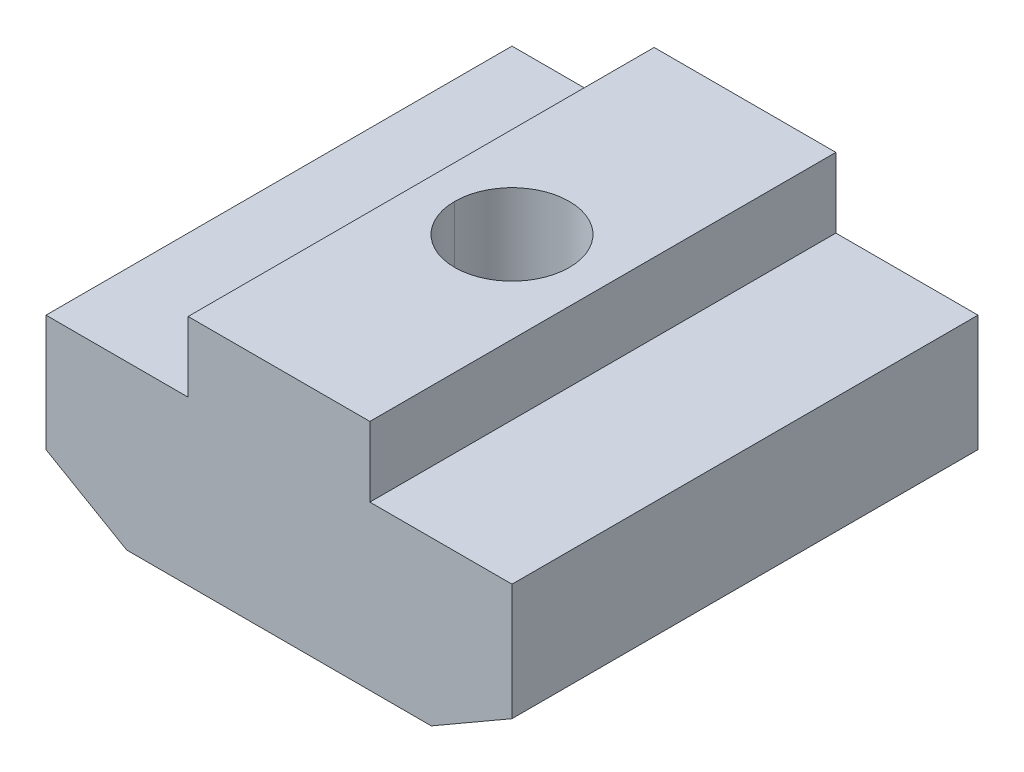
ISO-10303-21;
HEADER;
FILE_DESCRIPTION(('STEP AP214'),'2;1');
FILE_NAME('part.step','',(''),(''),'','','');
FILE_SCHEMA(('AUTOMOTIVE_DESIGN { 1 0 10303 214 1 1 1 1 }'));
ENDSEC;
DATA;
#1=APPLICATION_CONTEXT('core data for automotive mechanical design processes');
#2=APPLICATION_PROTOCOL_DEFINITION('international standard','automotive_design',2000,#1);
#3=PRODUCT_CONTEXT('',#1,'mechanical');
#4=PRODUCT('Part','Part','',(#3));
#5=PRODUCT_RELATED_PRODUCT_CATEGORY('part','',(#4));
#6=PRODUCT_DEFINITION_FORMATION('','',#4);
#7=PRODUCT_DEFINITION_CONTEXT('part definition',#1,'design');
#8=PRODUCT_DEFINITION('design','',#6,#7);
#9=PRODUCT_DEFINITION_SHAPE('','',#8);
#10=(LENGTH_UNIT() NAMED_UNIT(*) SI_UNIT(.MILLI.,.METRE.));
#11=(NAMED_UNIT(*) PLANE_ANGLE_UNIT() SI_UNIT($,.RADIAN.));
#12=(NAMED_UNIT(*) SI_UNIT($,.STERADIAN.) SOLID_ANGLE_UNIT());
#13=UNCERTAINTY_MEASURE_WITH_UNIT(LENGTH_MEASURE(1.E-05),#10,'distance_accuracy_value','');
#14=(GEOMETRIC_REPRESENTATION_CONTEXT(3) GLOBAL_UNCERTAINTY_ASSIGNED_CONTEXT((#13)) GLOBAL_UNIT_ASSIGNED_CONTEXT((#10,
#11,#12)) REPRESENTATION_CONTEXT('',''));
#15=CARTESIAN_POINT('',(0.,0.,0.));
#16=DIRECTION('',(0.,0.,1.));
#17=DIRECTION('',(1.,0.,0.));
#18=AXIS2_PLACEMENT_3D('',#15,#16,#17);
#19=CARTESIAN_POINT('',(-10.,-1.5,0.));
#20=DIRECTION('',(0.50000000000019,0.866025403784329,0.));
#21=DIRECTION('',(0.,0.,-1.));
#22=AXIS2_PLACEMENT_3D('',#19,#20,#21);
#23=PLANE('',#22);
#24=DIRECTION('',(0.,0.,1.));
#25=VECTOR('',#24,1.);
#26=CARTESIAN_POINT('',(-10.,-1.5,0.));
#27=LINE('',#26,#25);
#28=CARTESIAN_POINT('',(-10.,-1.5,-10.));
#29=VERTEX_POINT('',#28);
#30=CARTESIAN_POINT('',(-10.,-1.5,10.));
#31=VERTEX_POINT('',#30);
#32=EDGE_CURVE('E196',#29,#31,#27,.T.);
#33=ORIENTED_EDGE('',*,*,#32,.F.);
#34=DIRECTION('',(0.866025403784329,-0.50000000000019,0.));
#35=VECTOR('',#34,1.);
#36=CARTESIAN_POINT('',(-8.26794919243,-2.5,-10.));
#37=LINE('',#36,#35);
#38=CARTESIAN_POINT('',(-6.53589838486,-3.5,-10.));
#39=VERTEX_POINT('',#38);
#40=EDGE_CURVE('E172',#29,#39,#37,.T.);
#41=ORIENTED_EDGE('',*,*,#40,.T.);
#42=DIRECTION('',(0.,0.,1.));
#43=VECTOR('',#42,1.);
#44=CARTESIAN_POINT('',(-6.53589838486,-3.5,0.));
#45=LINE('',#44,#43);
#46=CARTESIAN_POINT('',(-6.53589838486,-3.5,10.));
#47=VERTEX_POINT('',#46);
#48=EDGE_CURVE('E11',#39,#47,#45,.T.);
#49=ORIENTED_EDGE('',*,*,#48,.T.);
#50=DIRECTION('',(-0.866025403784329,0.50000000000019,0.));
#51=VECTOR('',#50,1.);
#52=CARTESIAN_POINT('',(-8.26794919243,-2.5,10.));
#53=LINE('',#52,#51);
#54=EDGE_CURVE('E26',#47,#31,#53,.T.);
#55=ORIENTED_EDGE('',*,*,#54,.T.);
#56=EDGE_LOOP('',(#33,#41,#49,#55));
#57=FACE_BOUND('',#56,.T.);
#58=ADVANCED_FACE('F17',(#57),#23,.F.);
#59=CARTESIAN_POINT('',(10.,-3.5,0.));
#60=DIRECTION('',(0.,1.,0.));
#61=DIRECTION('',(1.,0.,0.));
#62=AXIS2_PLACEMENT_3D('',#59,#60,#61);
#63=PLANE('',#62);
#64=CARTESIAN_POINT('',(0.,-3.5,0.));
#65=DIRECTION('',(0.,1.,0.));
#66=DIRECTION('',(1.,0.,0.));
#67=AXIS2_PLACEMENT_3D('',#64,#65,#66);
#68=CIRCLE('',#67,2.4585);
#69=CARTESIAN_POINT('',(-2.4585,-3.5,0.));
#70=VERTEX_POINT('',#69);
#71=CARTESIAN_POINT('',(2.4585,-3.5,0.));
#72=VERTEX_POINT('',#71);
#73=EDGE_CURVE('E279',#70,#72,#68,.T.);
#74=ORIENTED_EDGE('',*,*,#73,.T.);
#75=CARTESIAN_POINT('',(0.,-3.5,0.));
#76=DIRECTION('',(0.,1.,0.));
#77=DIRECTION('',(1.,0.,0.));
#78=AXIS2_PLACEMENT_3D('',#75,#76,#77);
#79=CIRCLE('',#78,2.4585);
#80=EDGE_CURVE('E264',#72,#70,#79,.T.);
#81=ORIENTED_EDGE('',*,*,#80,.T.);
#82=EDGE_LOOP('',(#74,#81));
#83=FACE_BOUND('',#82,.T.);
#84=ORIENTED_EDGE('',*,*,#48,.F.);
#85=DIRECTION('',(1.,0.,0.));
#86=VECTOR('',#85,1.);
#87=CARTESIAN_POINT('',(0.,-3.5,-10.));
#88=LINE('',#87,#86);
#89=CARTESIAN_POINT('',(6.53589838486,-3.5,-10.));
#90=VERTEX_POINT('',#89);
#91=EDGE_CURVE('E174',#39,#90,#88,.T.);
#92=ORIENTED_EDGE('',*,*,#91,.T.);
#93=DIRECTION('',(0.,0.,1.));
#94=VECTOR('',#93,1.);
#95=CARTESIAN_POINT('',(6.53589838486,-3.5,0.));
#96=LINE('',#95,#94);
#97=CARTESIAN_POINT('',(6.53589838486,-3.5,10.));
#98=VERTEX_POINT('',#97);
#99=EDGE_CURVE('E185',#90,#98,#96,.T.);
#100=ORIENTED_EDGE('',*,*,#99,.T.);
#101=DIRECTION('',(1.,0.,0.));
#102=VECTOR('',#101,1.);
#103=CARTESIAN_POINT('',(0.,-3.5,10.));
#104=LINE('',#103,#102);
#105=EDGE_CURVE('E203',#47,#98,#104,.T.);
#106=ORIENTED_EDGE('',*,*,#105,.F.);
#107=EDGE_LOOP('',(#84,#92,#100,#106));
#108=FACE_BOUND('',#107,.T.);
#109=ADVANCED_FACE('F212',(#83,#108),#63,.F.);
#110=CARTESIAN_POINT('',(0.,0.,10.));
#111=DIRECTION('',(0.,0.,1.));
#112=DIRECTION('',(1.,0.,0.));
#113=AXIS2_PLACEMENT_3D('',#110,#111,#112);
#114=PLANE('',#113);
#115=ORIENTED_EDGE('',*,*,#105,.T.);
#116=DIRECTION('',(-0.866025403784329,-0.50000000000019,0.));
#117=VECTOR('',#116,1.);
#118=CARTESIAN_POINT('',(8.26794919243,-2.5,10.));
#119=LINE('',#118,#117);
#120=CARTESIAN_POINT('',(10.,-1.5,10.));
#121=VERTEX_POINT('',#120);
#122=EDGE_CURVE('E192',#121,#98,#119,.T.);
#123=ORIENTED_EDGE('',*,*,#122,.F.);
#124=DIRECTION('',(0.,1.,0.));
#125=VECTOR('',#124,1.);
#126=CARTESIAN_POINT('',(10.,1.,10.));
#127=LINE('',#126,#125);
#128=CARTESIAN_POINT('',(10.,3.5,10.));
#129=VERTEX_POINT('',#128);
#130=EDGE_CURVE('E152',#121,#129,#127,.T.);
#131=ORIENTED_EDGE('',*,*,#130,.T.);
#132=DIRECTION('',(-1.,0.,0.));
#133=VECTOR('',#132,1.);
#134=CARTESIAN_POINT('',(6.95,3.5,10.));
#135=LINE('',#134,#133);
#136=CARTESIAN_POINT('',(3.9,3.5,10.));
#137=VERTEX_POINT('',#136);
#138=EDGE_CURVE('E150',#129,#137,#135,.T.);
#139=ORIENTED_EDGE('',*,*,#138,.T.);
#140=DIRECTION('',(0.,1.,0.));
#141=VECTOR('',#140,1.);
#142=CARTESIAN_POINT('',(3.9,5.,10.));
#143=LINE('',#142,#141);
#144=CARTESIAN_POINT('',(3.9,6.5,10.));
#145=VERTEX_POINT('',#144);
#146=EDGE_CURVE('E134',#137,#145,#143,.T.);
#147=ORIENTED_EDGE('',*,*,#146,.T.);
#148=DIRECTION('',(-1.,0.,0.));
#149=VECTOR('',#148,1.);
#150=CARTESIAN_POINT('',(0.,6.5,10.));
#151=LINE('',#150,#149);
#152=CARTESIAN_POINT('',(-3.9,6.5,10.));
#153=VERTEX_POINT('',#152);
#154=EDGE_CURVE('E244',#145,#153,#151,.T.);
#155=ORIENTED_EDGE('',*,*,#154,.T.);
#156=DIRECTION('',(0.,-1.,0.));
#157=VECTOR('',#156,1.);
#158=CARTESIAN_POINT('',(-3.9,5.,10.));
#159=LINE('',#158,#157);
#160=CARTESIAN_POINT('',(-3.9,3.5,10.));
#161=VERTEX_POINT('',#160);
#162=EDGE_CURVE('E236',#153,#161,#159,.T.);
#163=ORIENTED_EDGE('',*,*,#162,.T.);
#164=DIRECTION('',(-1.,0.,0.));
#165=VECTOR('',#164,1.);
#166=CARTESIAN_POINT('',(-6.95,3.5,10.));
#167=LINE('',#166,#165);
#168=CARTESIAN_POINT('',(-10.,3.5,10.));
#169=VERTEX_POINT('',#168);
#170=EDGE_CURVE('E220',#161,#169,#167,.T.);
#171=ORIENTED_EDGE('',*,*,#170,.T.);
#172=DIRECTION('',(0.,-1.,0.));
#173=VECTOR('',#172,1.);
#174=CARTESIAN_POINT('',(-10.,1.,10.));
#175=LINE('',#174,#173);
#176=EDGE_CURVE('E200',#169,#31,#175,.T.);
#177=ORIENTED_EDGE('',*,*,#176,.T.);
#178=ORIENTED_EDGE('',*,*,#54,.F.);
#179=EDGE_LOOP('',(#115,#123,#131,#139,#147,#155,#163,#171,#177,#178));
#180=FACE_BOUND('',#179,.T.);
#181=ADVANCED_FACE('F19',(#180),#114,.T.);
#182=CARTESIAN_POINT('',(0.,0.,-10.));
#183=DIRECTION('',(0.,0.,1.));
#184=DIRECTION('',(1.,0.,0.));
#185=AXIS2_PLACEMENT_3D('',#182,#183,#184);
#186=PLANE('',#185);
#187=ORIENTED_EDGE('',*,*,#40,.F.);
#188=DIRECTION('',(0.,-1.,0.));
#189=VECTOR('',#188,1.);
#190=CARTESIAN_POINT('',(-10.,1.,-10.));
#191=LINE('',#190,#189);
#192=CARTESIAN_POINT('',(-10.,3.5,-10.));
#193=VERTEX_POINT('',#192);
#194=EDGE_CURVE('E175',#193,#29,#191,.T.);
#195=ORIENTED_EDGE('',*,*,#194,.F.);
#196=DIRECTION('',(-1.,0.,0.));
#197=VECTOR('',#196,1.);
#198=CARTESIAN_POINT('',(-6.95,3.5,-10.));
#199=LINE('',#198,#197);
#200=CARTESIAN_POINT('',(-3.9,3.5,-10.));
#201=VERTEX_POINT('',#200);
#202=EDGE_CURVE('E230',#201,#193,#199,.T.);
#203=ORIENTED_EDGE('',*,*,#202,.F.);
#204=DIRECTION('',(0.,-1.,0.));
#205=VECTOR('',#204,1.);
#206=CARTESIAN_POINT('',(-3.9,5.,-10.));
#207=LINE('',#206,#205);
#208=CARTESIAN_POINT('',(-3.9,6.5,-10.));
#209=VERTEX_POINT('',#208);
#210=EDGE_CURVE('E247',#209,#201,#207,.T.);
#211=ORIENTED_EDGE('',*,*,#210,.F.);
#212=DIRECTION('',(-1.,0.,0.));
#213=VECTOR('',#212,1.);
#214=CARTESIAN_POINT('',(0.,6.5,-10.));
#215=LINE('',#214,#213);
#216=CARTESIAN_POINT('',(3.9,6.5,-10.));
#217=VERTEX_POINT('',#216);
#218=EDGE_CURVE('E258',#217,#209,#215,.T.);
#219=ORIENTED_EDGE('',*,*,#218,.F.);
#220=DIRECTION('',(0.,1.,0.));
#221=VECTOR('',#220,1.);
#222=CARTESIAN_POINT('',(3.9,5.,-10.));
#223=LINE('',#222,#221);
#224=CARTESIAN_POINT('',(3.9,3.5,-10.));
#225=VERTEX_POINT('',#224);
#226=EDGE_CURVE('E147',#225,#217,#223,.T.);
#227=ORIENTED_EDGE('',*,*,#226,.F.);
#228=DIRECTION('',(-1.,0.,0.));
#229=VECTOR('',#228,1.);
#230=CARTESIAN_POINT('',(6.95,3.5,-10.));
#231=LINE('',#230,#229);
#232=CARTESIAN_POINT('',(10.,3.5,-10.));
#233=VERTEX_POINT('',#232);
#234=EDGE_CURVE('E160',#233,#225,#231,.T.);
#235=ORIENTED_EDGE('',*,*,#234,.F.);
#236=DIRECTION('',(0.,1.,0.));
#237=VECTOR('',#236,1.);
#238=CARTESIAN_POINT('',(10.,1.,-10.));
#239=LINE('',#238,#237);
#240=CARTESIAN_POINT('',(10.,-1.5,-10.));
#241=VERTEX_POINT('',#240);
#242=EDGE_CURVE('E180',#241,#233,#239,.T.);
#243=ORIENTED_EDGE('',*,*,#242,.F.);
#244=DIRECTION('',(0.866025403784329,0.50000000000019,0.));
#245=VECTOR('',#244,1.);
#246=CARTESIAN_POINT('',(8.26794919243,-2.5,-10.));
#247=LINE('',#246,#245);
#248=EDGE_CURVE('E189',#90,#241,#247,.T.);
#249=ORIENTED_EDGE('',*,*,#248,.F.);
#250=ORIENTED_EDGE('',*,*,#91,.F.);
#251=EDGE_LOOP('',(#187,#195,#203,#211,#219,#227,#235,#243,#249,#250));
#252=FACE_BOUND('',#251,.T.);
#253=ADVANCED_FACE('F216',(#252),#186,.F.);
#254=CARTESIAN_POINT('',(-10.,-3.5,0.));
#255=DIRECTION('',(1.,0.,0.));
#256=DIRECTION('',(0.,1.,0.));
#257=AXIS2_PLACEMENT_3D('',#254,#255,#256);
#258=PLANE('',#257);
#259=ORIENTED_EDGE('',*,*,#32,.T.);
#260=ORIENTED_EDGE('',*,*,#176,.F.);
#261=DIRECTION('',(0.,0.,1.));
#262=VECTOR('',#261,1.);
#263=CARTESIAN_POINT('',(-10.,3.5,0.));
#264=LINE('',#263,#262);
#265=EDGE_CURVE('E224',#193,#169,#264,.T.);
#266=ORIENTED_EDGE('',*,*,#265,.F.);
#267=ORIENTED_EDGE('',*,*,#194,.T.);
#268=EDGE_LOOP('',(#259,#260,#266,#267));
#269=FACE_BOUND('',#268,.T.);
#270=ADVANCED_FACE('F315',(#269),#258,.F.);
#271=CARTESIAN_POINT('',(10.,-1.5,0.));
#272=DIRECTION('',(-0.50000000000019,0.866025403784329,0.));
#273=DIRECTION('',(0.,0.,1.));
#274=AXIS2_PLACEMENT_3D('',#271,#272,#273);
#275=PLANE('',#274);
#276=ORIENTED_EDGE('',*,*,#99,.F.);
#277=ORIENTED_EDGE('',*,*,#248,.T.);
#278=DIRECTION('',(0.,0.,1.));
#279=VECTOR('',#278,1.);
#280=CARTESIAN_POINT('',(10.,-1.5,0.));
#281=LINE('',#280,#279);
#282=EDGE_CURVE('E146',#241,#121,#281,.T.);
#283=ORIENTED_EDGE('',*,*,#282,.T.);
#284=ORIENTED_EDGE('',*,*,#122,.T.);
#285=EDGE_LOOP('',(#276,#277,#283,#284));
#286=FACE_BOUND('',#285,.T.);
#287=ADVANCED_FACE('F210',(#286),#275,.F.);
#288=CARTESIAN_POINT('',(10.,3.5,0.));
#289=DIRECTION('',(-1.,0.,0.));
#290=DIRECTION('',(0.,0.,1.));
#291=AXIS2_PLACEMENT_3D('',#288,#289,#290);
#292=PLANE('',#291);
#293=ORIENTED_EDGE('',*,*,#282,.F.);
#294=ORIENTED_EDGE('',*,*,#242,.T.);
#295=DIRECTION('',(0.,0.,1.));
#296=VECTOR('',#295,1.);
#297=CARTESIAN_POINT('',(10.,3.5,0.));
#298=LINE('',#297,#296);
#299=EDGE_CURVE('E166',#233,#129,#298,.T.);
#300=ORIENTED_EDGE('',*,*,#299,.T.);
#301=ORIENTED_EDGE('',*,*,#130,.F.);
#302=EDGE_LOOP('',(#293,#294,#300,#301));
#303=FACE_BOUND('',#302,.T.);
#304=ADVANCED_FACE('F218',(#303),#292,.F.);
#305=CARTESIAN_POINT('',(3.9,6.5,0.));
#306=DIRECTION('',(-1.,0.,0.));
#307=DIRECTION('',(0.,0.,1.));
#308=AXIS2_PLACEMENT_3D('',#305,#306,#307);
#309=PLANE('',#308);
#310=DIRECTION('',(0.,0.,1.));
#311=VECTOR('',#310,1.);
#312=CARTESIAN_POINT('',(3.9,3.5,0.));
#313=LINE('',#312,#311);
#314=EDGE_CURVE('E138',#225,#137,#313,.T.);
#315=ORIENTED_EDGE('',*,*,#314,.F.);
#316=ORIENTED_EDGE('',*,*,#226,.T.);
#317=DIRECTION('',(0.,0.,1.));
#318=VECTOR('',#317,1.);
#319=CARTESIAN_POINT('',(3.9,6.5,0.));
#320=LINE('',#319,#318);
#321=EDGE_CURVE('E141',#217,#145,#320,.T.);
#322=ORIENTED_EDGE('',*,*,#321,.T.);
#323=ORIENTED_EDGE('',*,*,#146,.F.);
#324=EDGE_LOOP('',(#315,#316,#322,#323));
#325=FACE_BOUND('',#324,.T.);
#326=ADVANCED_FACE('F136',(#325),#309,.F.);
#327=CARTESIAN_POINT('',(3.9,3.5,0.));
#328=DIRECTION('',(0.,-1.,0.));
#329=DIRECTION('',(0.,0.,-1.));
#330=AXIS2_PLACEMENT_3D('',#327,#328,#329);
#331=PLANE('',#330);
#332=ORIENTED_EDGE('',*,*,#299,.F.);
#333=ORIENTED_EDGE('',*,*,#234,.T.);
#334=ORIENTED_EDGE('',*,*,#314,.T.);
#335=ORIENTED_EDGE('',*,*,#138,.F.);
#336=EDGE_LOOP('',(#332,#333,#334,#335));
#337=FACE_BOUND('',#336,.T.);
#338=ADVANCED_FACE('F158',(#337),#331,.F.);
#339=CARTESIAN_POINT('',(3.9,3.5,0.));
#340=DIRECTION('',(0.,-1.,0.));
#341=DIRECTION('',(0.,0.,-1.));
#342=AXIS2_PLACEMENT_3D('',#339,#340,#341);
#343=PLANE('',#342);
#344=DIRECTION('',(0.,0.,1.));
#345=VECTOR('',#344,1.);
#346=CARTESIAN_POINT('',(-3.9,3.5,0.));
#347=LINE('',#346,#345);
#348=EDGE_CURVE('E243',#201,#161,#347,.T.);
#349=ORIENTED_EDGE('',*,*,#348,.F.);
#350=ORIENTED_EDGE('',*,*,#202,.T.);
#351=ORIENTED_EDGE('',*,*,#265,.T.);
#352=ORIENTED_EDGE('',*,*,#170,.F.);
#353=EDGE_LOOP('',(#349,#350,#351,#352));
#354=FACE_BOUND('',#353,.T.);
#355=ADVANCED_FACE('F318',(#354),#343,.F.);
#356=CARTESIAN_POINT('',(-3.9,3.5,0.));
#357=DIRECTION('',(1.,0.,0.));
#358=DIRECTION('',(0.,1.,0.));
#359=AXIS2_PLACEMENT_3D('',#356,#357,#358);
#360=PLANE('',#359);
#361=DIRECTION('',(0.,0.,1.));
#362=VECTOR('',#361,1.);
#363=CARTESIAN_POINT('',(-3.9,6.5,0.));
#364=LINE('',#363,#362);
#365=EDGE_CURVE('E248',#209,#153,#364,.T.);
#366=ORIENTED_EDGE('',*,*,#365,.F.);
#367=ORIENTED_EDGE('',*,*,#210,.T.);
#368=ORIENTED_EDGE('',*,*,#348,.T.);
#369=ORIENTED_EDGE('',*,*,#162,.F.);
#370=EDGE_LOOP('',(#366,#367,#368,#369));
#371=FACE_BOUND('',#370,.T.);
#372=ADVANCED_FACE('F312',(#371),#360,.F.);
#373=CARTESIAN_POINT('',(-3.9,6.5,0.));
#374=DIRECTION('',(0.,-1.,0.));
#375=DIRECTION('',(0.,0.,-1.));
#376=AXIS2_PLACEMENT_3D('',#373,#374,#375);
#377=PLANE('',#376);
#378=CARTESIAN_POINT('',(0.,6.5,0.));
#379=DIRECTION('',(0.,1.,0.));
#380=DIRECTION('',(1.,0.,0.));
#381=AXIS2_PLACEMENT_3D('',#378,#379,#380);
#382=CIRCLE('',#381,2.4585);
#383=CARTESIAN_POINT('',(-2.4585,6.5,0.));
#384=VERTEX_POINT('',#383);
#385=CARTESIAN_POINT('',(2.4585,6.5,0.));
#386=VERTEX_POINT('',#385);
#387=EDGE_CURVE('E274',#384,#386,#382,.T.);
#388=ORIENTED_EDGE('',*,*,#387,.F.);
#389=CARTESIAN_POINT('',(0.,6.5,0.));
#390=DIRECTION('',(0.,1.,0.));
#391=DIRECTION('',(1.,0.,0.));
#392=AXIS2_PLACEMENT_3D('',#389,#390,#391);
#393=CIRCLE('',#392,2.4585);
#394=EDGE_CURVE('E261',#386,#384,#393,.T.);
#395=ORIENTED_EDGE('',*,*,#394,.F.);
#396=EDGE_LOOP('',(#388,#395));
#397=FACE_BOUND('',#396,.T.);
#398=ORIENTED_EDGE('',*,*,#321,.F.);
#399=ORIENTED_EDGE('',*,*,#218,.T.);
#400=ORIENTED_EDGE('',*,*,#365,.T.);
#401=ORIENTED_EDGE('',*,*,#154,.F.);
#402=EDGE_LOOP('',(#398,#399,#400,#401));
#403=FACE_BOUND('',#402,.T.);
#404=ADVANCED_FACE('F293',(#397,#403),#377,.F.);
#405=CARTESIAN_POINT('',(0.,-3.5,0.));
#406=DIRECTION('',(0.,1.,0.));
#407=DIRECTION('',(1.,0.,0.));
#408=AXIS2_PLACEMENT_3D('',#405,#406,#407);
#409=CYLINDRICAL_SURFACE('',#408,2.4585);
#410=ORIENTED_EDGE('',*,*,#80,.F.);
#411=DIRECTION('',(0.,-1.,0.));
#412=VECTOR('',#411,1.);
#413=CARTESIAN_POINT('',(2.4585,1.34499999996,0.));
#414=LINE('',#413,#412);
#415=EDGE_CURVE('E270',#386,#72,#414,.T.);
#416=ORIENTED_EDGE('',*,*,#415,.F.);
#417=ORIENTED_EDGE('',*,*,#394,.T.);
#418=DIRECTION('',(0.,-1.,0.));
#419=VECTOR('',#418,1.);
#420=CARTESIAN_POINT('',(-2.4585,1.34499999996,0.));
#421=LINE('',#420,#419);
#422=EDGE_CURVE('E275',#384,#70,#421,.T.);
#423=ORIENTED_EDGE('',*,*,#422,.T.);
#424=EDGE_LOOP('',(#410,#416,#417,#423));
#425=FACE_BOUND('',#424,.T.);
#426=ADVANCED_FACE('F296',(#425),#409,.F.);
#427=CARTESIAN_POINT('',(0.,-3.5,0.));
#428=DIRECTION('',(0.,1.,0.));
#429=DIRECTION('',(1.,0.,0.));
#430=AXIS2_PLACEMENT_3D('',#427,#428,#429);
#431=CYLINDRICAL_SURFACE('',#430,2.4585);
#432=ORIENTED_EDGE('',*,*,#73,.F.);
#433=ORIENTED_EDGE('',*,*,#422,.F.);
#434=ORIENTED_EDGE('',*,*,#387,.T.);
#435=ORIENTED_EDGE('',*,*,#415,.T.);
#436=EDGE_LOOP('',(#432,#433,#434,#435));
#437=FACE_BOUND('',#436,.T.);
#438=ADVANCED_FACE('F290',(#437),#431,.F.);
#439=CLOSED_SHELL('',(#58,#109,#181,#253,#270,#287,#304,#326,#338,#355,#372,#404,#426,#438));
#440=MANIFOLD_SOLID_BREP('B1',#439);
#441=ADVANCED_BREP_SHAPE_REPRESENTATION('',(#18,#440),#14);
#442=SHAPE_DEFINITION_REPRESENTATION(#9,#441);
ENDSEC;
END-ISO-10303-21;
